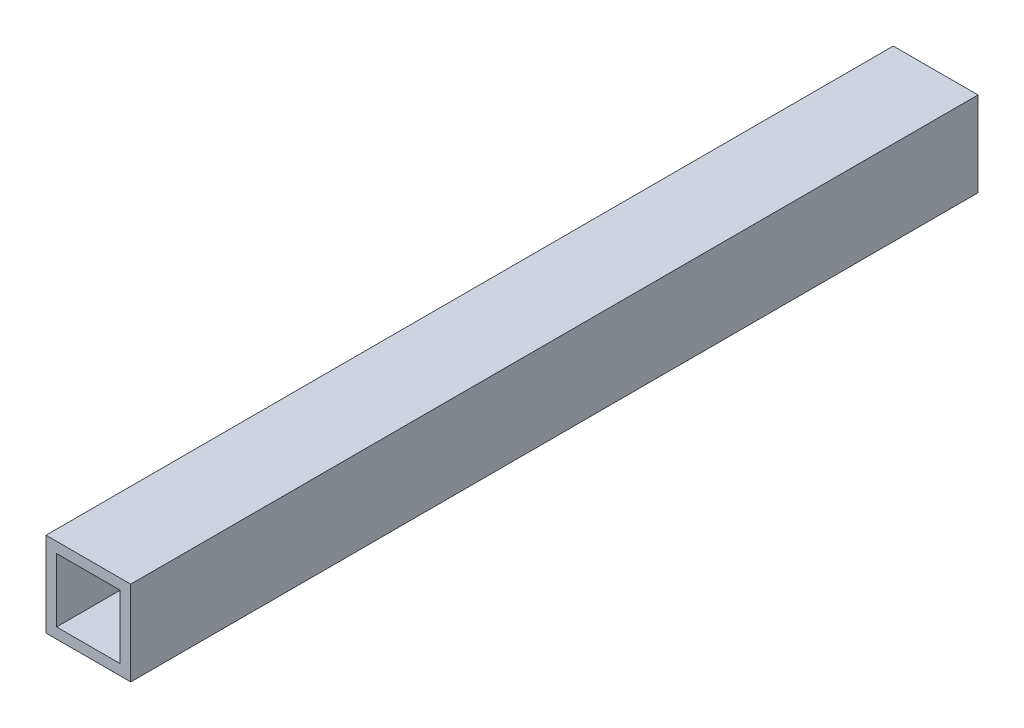
ISO-10303-21;
HEADER;
FILE_DESCRIPTION(('STEP AP214'),'2;1');
FILE_NAME('part.step','',(''),(''),'','','');
FILE_SCHEMA(('AUTOMOTIVE_DESIGN { 1 0 10303 214 1 1 1 1 }'));
ENDSEC;
DATA;
#1=APPLICATION_CONTEXT('core data for automotive mechanical design processes');
#2=APPLICATION_PROTOCOL_DEFINITION('international standard','automotive_design',2000,#1);
#3=PRODUCT_CONTEXT('',#1,'mechanical');
#4=PRODUCT('Part','Part','',(#3));
#5=PRODUCT_RELATED_PRODUCT_CATEGORY('part','',(#4));
#6=PRODUCT_DEFINITION_FORMATION('','',#4);
#7=PRODUCT_DEFINITION_CONTEXT('part definition',#1,'design');
#8=PRODUCT_DEFINITION('design','',#6,#7);
#9=PRODUCT_DEFINITION_SHAPE('','',#8);
#10=(LENGTH_UNIT() NAMED_UNIT(*) SI_UNIT(.MILLI.,.METRE.));
#11=(NAMED_UNIT(*) PLANE_ANGLE_UNIT() SI_UNIT($,.RADIAN.));
#12=(NAMED_UNIT(*) SI_UNIT($,.STERADIAN.) SOLID_ANGLE_UNIT());
#13=UNCERTAINTY_MEASURE_WITH_UNIT(LENGTH_MEASURE(1.E-05),#10,'distance_accuracy_value','');
#14=(GEOMETRIC_REPRESENTATION_CONTEXT(3) GLOBAL_UNCERTAINTY_ASSIGNED_CONTEXT((#13)) GLOBAL_UNIT_ASSIGNED_CONTEXT((#10,
#11,#12)) REPRESENTATION_CONTEXT('',''));
#15=CARTESIAN_POINT('',(0.,0.,0.));
#16=DIRECTION('',(0.,0.,1.));
#17=DIRECTION('',(1.,0.,0.));
#18=AXIS2_PLACEMENT_3D('',#15,#16,#17);
#19=CARTESIAN_POINT('',(0.,0.,200.));
#20=DIRECTION('',(0.,0.,-1.));
#21=DIRECTION('',(-1.,0.,0.));
#22=AXIS2_PLACEMENT_3D('',#19,#20,#21);
#23=PLANE('',#22);
#24=DIRECTION('',(0.,-1.,0.));
#25=VECTOR('',#24,1.);
#26=CARTESIAN_POINT('',(0.,0.,200.));
#27=LINE('',#26,#25);
#28=CARTESIAN_POINT('',(0.,20.,200.));
#29=VERTEX_POINT('',#28);
#30=CARTESIAN_POINT('',(0.,0.,200.));
#31=VERTEX_POINT('',#30);
#32=EDGE_CURVE('E140',#29,#31,#27,.T.);
#33=ORIENTED_EDGE('',*,*,#32,.T.);
#34=DIRECTION('',(1.,0.,0.));
#35=VECTOR('',#34,1.);
#36=CARTESIAN_POINT('',(0.,0.,200.));
#37=LINE('',#36,#35);
#38=CARTESIAN_POINT('',(20.,0.,200.));
#39=VERTEX_POINT('',#38);
#40=EDGE_CURVE('E143',#31,#39,#37,.T.);
#41=ORIENTED_EDGE('',*,*,#40,.T.);
#42=DIRECTION('',(0.,1.,0.));
#43=VECTOR('',#42,1.);
#44=CARTESIAN_POINT('',(20.,0.,200.));
#45=LINE('',#44,#43);
#46=CARTESIAN_POINT('',(20.,20.,200.));
#47=VERTEX_POINT('',#46);
#48=EDGE_CURVE('E146',#39,#47,#45,.T.);
#49=ORIENTED_EDGE('',*,*,#48,.T.);
#50=DIRECTION('',(-1.,0.,0.));
#51=VECTOR('',#50,1.);
#52=CARTESIAN_POINT('',(0.,20.,200.));
#53=LINE('',#52,#51);
#54=EDGE_CURVE('E148',#47,#29,#53,.T.);
#55=ORIENTED_EDGE('',*,*,#54,.T.);
#56=EDGE_LOOP('',(#33,#41,#49,#55));
#57=FACE_BOUND('',#56,.T.);
#58=DIRECTION('',(0.,1.,0.));
#59=VECTOR('',#58,1.);
#60=CARTESIAN_POINT('',(17.5,17.5,200.));
#61=LINE('',#60,#59);
#62=CARTESIAN_POINT('',(17.5,2.5,200.));
#63=VERTEX_POINT('',#62);
#64=CARTESIAN_POINT('',(17.5,17.5,200.));
#65=VERTEX_POINT('',#64);
#66=EDGE_CURVE('E104',#63,#65,#61,.T.);
#67=ORIENTED_EDGE('',*,*,#66,.F.);
#68=DIRECTION('',(1.,0.,0.));
#69=VECTOR('',#68,1.);
#70=CARTESIAN_POINT('',(2.5,2.5,200.));
#71=LINE('',#70,#69);
#72=CARTESIAN_POINT('',(2.5,2.5,200.));
#73=VERTEX_POINT('',#72);
#74=EDGE_CURVE('E126',#73,#63,#71,.T.);
#75=ORIENTED_EDGE('',*,*,#74,.F.);
#76=DIRECTION('',(0.,-1.,0.));
#77=VECTOR('',#76,1.);
#78=CARTESIAN_POINT('',(2.5,17.5,200.));
#79=LINE('',#78,#77);
#80=CARTESIAN_POINT('',(2.5,17.5,200.));
#81=VERTEX_POINT('',#80);
#82=EDGE_CURVE('E124',#81,#73,#79,.T.);
#83=ORIENTED_EDGE('',*,*,#82,.F.);
#84=DIRECTION('',(-1.,0.,0.));
#85=VECTOR('',#84,1.);
#86=CARTESIAN_POINT('',(2.5,17.5,200.));
#87=LINE('',#86,#85);
#88=EDGE_CURVE('E112',#65,#81,#87,.T.);
#89=ORIENTED_EDGE('',*,*,#88,.F.);
#90=EDGE_LOOP('',(#67,#75,#83,#89));
#91=FACE_BOUND('',#90,.T.);
#92=ADVANCED_FACE('F39',(#57,#91),#23,.F.);
#93=CARTESIAN_POINT('',(0.,0.,0.));
#94=DIRECTION('',(0.,0.,-1.));
#95=DIRECTION('',(-1.,0.,0.));
#96=AXIS2_PLACEMENT_3D('',#93,#94,#95);
#97=PLANE('',#96);
#98=DIRECTION('',(0.,-1.,0.));
#99=VECTOR('',#98,1.);
#100=CARTESIAN_POINT('',(0.,0.,0.));
#101=LINE('',#100,#99);
#102=CARTESIAN_POINT('',(0.,20.,0.));
#103=VERTEX_POINT('',#102);
#104=CARTESIAN_POINT('',(0.,0.,0.));
#105=VERTEX_POINT('',#104);
#106=EDGE_CURVE('E120',#103,#105,#101,.T.);
#107=ORIENTED_EDGE('',*,*,#106,.F.);
#108=DIRECTION('',(-1.,0.,0.));
#109=VECTOR('',#108,1.);
#110=CARTESIAN_POINT('',(0.,20.,0.));
#111=LINE('',#110,#109);
#112=CARTESIAN_POINT('',(20.,20.,0.));
#113=VERTEX_POINT('',#112);
#114=EDGE_CURVE('E144',#113,#103,#111,.T.);
#115=ORIENTED_EDGE('',*,*,#114,.F.);
#116=DIRECTION('',(0.,1.,0.));
#117=VECTOR('',#116,1.);
#118=CARTESIAN_POINT('',(20.,0.,0.));
#119=LINE('',#118,#117);
#120=CARTESIAN_POINT('',(20.,0.,0.));
#121=VERTEX_POINT('',#120);
#122=EDGE_CURVE('E155',#121,#113,#119,.T.);
#123=ORIENTED_EDGE('',*,*,#122,.F.);
#124=DIRECTION('',(1.,0.,0.));
#125=VECTOR('',#124,1.);
#126=CARTESIAN_POINT('',(0.,0.,0.));
#127=LINE('',#126,#125);
#128=EDGE_CURVE('E153',#105,#121,#127,.T.);
#129=ORIENTED_EDGE('',*,*,#128,.F.);
#130=EDGE_LOOP('',(#107,#115,#123,#129));
#131=FACE_BOUND('',#130,.T.);
#132=DIRECTION('',(1.,0.,0.));
#133=VECTOR('',#132,1.);
#134=CARTESIAN_POINT('',(2.5,2.5,0.));
#135=LINE('',#134,#133);
#136=CARTESIAN_POINT('',(2.5,2.5,0.));
#137=VERTEX_POINT('',#136);
#138=CARTESIAN_POINT('',(17.5,2.5,0.));
#139=VERTEX_POINT('',#138);
#140=EDGE_CURVE('E113',#137,#139,#135,.T.);
#141=ORIENTED_EDGE('',*,*,#140,.T.);
#142=DIRECTION('',(0.,1.,0.));
#143=VECTOR('',#142,1.);
#144=CARTESIAN_POINT('',(17.5,17.5,0.));
#145=LINE('',#144,#143);
#146=CARTESIAN_POINT('',(17.5,17.5,0.));
#147=VERTEX_POINT('',#146);
#148=EDGE_CURVE('E62',#139,#147,#145,.T.);
#149=ORIENTED_EDGE('',*,*,#148,.T.);
#150=DIRECTION('',(-1.,0.,0.));
#151=VECTOR('',#150,1.);
#152=CARTESIAN_POINT('',(2.5,17.5,0.));
#153=LINE('',#152,#151);
#154=CARTESIAN_POINT('',(2.5,17.5,0.));
#155=VERTEX_POINT('',#154);
#156=EDGE_CURVE('E119',#147,#155,#153,.T.);
#157=ORIENTED_EDGE('',*,*,#156,.T.);
#158=DIRECTION('',(0.,-1.,0.));
#159=VECTOR('',#158,1.);
#160=CARTESIAN_POINT('',(2.5,17.5,0.));
#161=LINE('',#160,#159);
#162=EDGE_CURVE('E132',#155,#137,#161,.T.);
#163=ORIENTED_EDGE('',*,*,#162,.T.);
#164=EDGE_LOOP('',(#141,#149,#157,#163));
#165=FACE_BOUND('',#164,.T.);
#166=ADVANCED_FACE('F173',(#131,#165),#97,.T.);
#167=CARTESIAN_POINT('',(0.,0.,200.));
#168=DIRECTION('',(1.,0.,0.));
#169=DIRECTION('',(0.,0.,-1.));
#170=AXIS2_PLACEMENT_3D('',#167,#168,#169);
#171=PLANE('',#170);
#172=ORIENTED_EDGE('',*,*,#106,.T.);
#173=DIRECTION('',(0.,0.,-1.));
#174=VECTOR('',#173,1.);
#175=CARTESIAN_POINT('',(0.,0.,200.));
#176=LINE('',#175,#174);
#177=EDGE_CURVE('E11',#31,#105,#176,.T.);
#178=ORIENTED_EDGE('',*,*,#177,.F.);
#179=ORIENTED_EDGE('',*,*,#32,.F.);
#180=DIRECTION('',(0.,0.,-1.));
#181=VECTOR('',#180,1.);
#182=CARTESIAN_POINT('',(0.,20.,200.));
#183=LINE('',#182,#181);
#184=EDGE_CURVE('E150',#29,#103,#183,.T.);
#185=ORIENTED_EDGE('',*,*,#184,.T.);
#186=EDGE_LOOP('',(#172,#178,#179,#185));
#187=FACE_BOUND('',#186,.T.);
#188=ADVANCED_FACE('F41',(#187),#171,.F.);
#189=CARTESIAN_POINT('',(0.,0.,200.));
#190=DIRECTION('',(0.,1.,0.));
#191=DIRECTION('',(0.,0.,1.));
#192=AXIS2_PLACEMENT_3D('',#189,#190,#191);
#193=PLANE('',#192);
#194=ORIENTED_EDGE('',*,*,#128,.T.);
#195=DIRECTION('',(0.,0.,-1.));
#196=VECTOR('',#195,1.);
#197=CARTESIAN_POINT('',(20.,0.,200.));
#198=LINE('',#197,#196);
#199=EDGE_CURVE('E47',#39,#121,#198,.T.);
#200=ORIENTED_EDGE('',*,*,#199,.F.);
#201=ORIENTED_EDGE('',*,*,#40,.F.);
#202=ORIENTED_EDGE('',*,*,#177,.T.);
#203=EDGE_LOOP('',(#194,#200,#201,#202));
#204=FACE_BOUND('',#203,.T.);
#205=ADVANCED_FACE('F183',(#204),#193,.F.);
#206=CARTESIAN_POINT('',(20.,0.,200.));
#207=DIRECTION('',(-1.,0.,0.));
#208=DIRECTION('',(0.,0.,1.));
#209=AXIS2_PLACEMENT_3D('',#206,#207,#208);
#210=PLANE('',#209);
#211=ORIENTED_EDGE('',*,*,#122,.T.);
#212=DIRECTION('',(0.,0.,-1.));
#213=VECTOR('',#212,1.);
#214=CARTESIAN_POINT('',(20.,20.,200.));
#215=LINE('',#214,#213);
#216=EDGE_CURVE('E160',#47,#113,#215,.T.);
#217=ORIENTED_EDGE('',*,*,#216,.F.);
#218=ORIENTED_EDGE('',*,*,#48,.F.);
#219=ORIENTED_EDGE('',*,*,#199,.T.);
#220=EDGE_LOOP('',(#211,#217,#218,#219));
#221=FACE_BOUND('',#220,.T.);
#222=ADVANCED_FACE('F167',(#221),#210,.F.);
#223=CARTESIAN_POINT('',(0.,20.,200.));
#224=DIRECTION('',(0.,-1.,0.));
#225=DIRECTION('',(0.,0.,-1.));
#226=AXIS2_PLACEMENT_3D('',#223,#224,#225);
#227=PLANE('',#226);
#228=ORIENTED_EDGE('',*,*,#114,.T.);
#229=ORIENTED_EDGE('',*,*,#184,.F.);
#230=ORIENTED_EDGE('',*,*,#54,.F.);
#231=ORIENTED_EDGE('',*,*,#216,.T.);
#232=EDGE_LOOP('',(#228,#229,#230,#231));
#233=FACE_BOUND('',#232,.T.);
#234=ADVANCED_FACE('F177',(#233),#227,.F.);
#235=CARTESIAN_POINT('',(17.5,17.5,200.));
#236=DIRECTION('',(-1.,0.,0.));
#237=DIRECTION('',(0.,0.,1.));
#238=AXIS2_PLACEMENT_3D('',#235,#236,#237);
#239=PLANE('',#238);
#240=ORIENTED_EDGE('',*,*,#148,.F.);
#241=DIRECTION('',(0.,0.,-1.));
#242=VECTOR('',#241,1.);
#243=CARTESIAN_POINT('',(17.5,2.5,200.));
#244=LINE('',#243,#242);
#245=EDGE_CURVE('E108',#63,#139,#244,.T.);
#246=ORIENTED_EDGE('',*,*,#245,.F.);
#247=ORIENTED_EDGE('',*,*,#66,.T.);
#248=DIRECTION('',(0.,0.,-1.));
#249=VECTOR('',#248,1.);
#250=CARTESIAN_POINT('',(17.5,17.5,200.));
#251=LINE('',#250,#249);
#252=EDGE_CURVE('E107',#65,#147,#251,.T.);
#253=ORIENTED_EDGE('',*,*,#252,.T.);
#254=EDGE_LOOP('',(#240,#246,#247,#253));
#255=FACE_BOUND('',#254,.T.);
#256=ADVANCED_FACE('F106',(#255),#239,.T.);
#257=CARTESIAN_POINT('',(2.5,17.5,200.));
#258=DIRECTION('',(0.,-1.,0.));
#259=DIRECTION('',(0.,0.,-1.));
#260=AXIS2_PLACEMENT_3D('',#257,#258,#259);
#261=PLANE('',#260);
#262=ORIENTED_EDGE('',*,*,#156,.F.);
#263=ORIENTED_EDGE('',*,*,#252,.F.);
#264=ORIENTED_EDGE('',*,*,#88,.T.);
#265=DIRECTION('',(0.,0.,-1.));
#266=VECTOR('',#265,1.);
#267=CARTESIAN_POINT('',(2.5,17.5,200.));
#268=LINE('',#267,#266);
#269=EDGE_CURVE('E121',#81,#155,#268,.T.);
#270=ORIENTED_EDGE('',*,*,#269,.T.);
#271=EDGE_LOOP('',(#262,#263,#264,#270));
#272=FACE_BOUND('',#271,.T.);
#273=ADVANCED_FACE('F116',(#272),#261,.T.);
#274=CARTESIAN_POINT('',(2.5,17.5,200.));
#275=DIRECTION('',(1.,0.,0.));
#276=DIRECTION('',(0.,1.,0.));
#277=AXIS2_PLACEMENT_3D('',#274,#275,#276);
#278=PLANE('',#277);
#279=ORIENTED_EDGE('',*,*,#162,.F.);
#280=ORIENTED_EDGE('',*,*,#269,.F.);
#281=ORIENTED_EDGE('',*,*,#82,.T.);
#282=DIRECTION('',(0.,0.,-1.));
#283=VECTOR('',#282,1.);
#284=CARTESIAN_POINT('',(2.5,2.5,200.));
#285=LINE('',#284,#283);
#286=EDGE_CURVE('E54',#73,#137,#285,.T.);
#287=ORIENTED_EDGE('',*,*,#286,.T.);
#288=EDGE_LOOP('',(#279,#280,#281,#287));
#289=FACE_BOUND('',#288,.T.);
#290=ADVANCED_FACE('F206',(#289),#278,.T.);
#291=CARTESIAN_POINT('',(2.5,2.5,200.));
#292=DIRECTION('',(0.,1.,0.));
#293=DIRECTION('',(0.,0.,1.));
#294=AXIS2_PLACEMENT_3D('',#291,#292,#293);
#295=PLANE('',#294);
#296=ORIENTED_EDGE('',*,*,#140,.F.);
#297=ORIENTED_EDGE('',*,*,#286,.F.);
#298=ORIENTED_EDGE('',*,*,#74,.T.);
#299=ORIENTED_EDGE('',*,*,#245,.T.);
#300=EDGE_LOOP('',(#296,#297,#298,#299));
#301=FACE_BOUND('',#300,.T.);
#302=ADVANCED_FACE('F210',(#301),#295,.T.);
#303=CLOSED_SHELL('',(#92,#166,#188,#205,#222,#234,#256,#273,#290,#302));
#304=MANIFOLD_SOLID_BREP('B2',#303);
#305=ADVANCED_BREP_SHAPE_REPRESENTATION('',(#18,#304),#14);
#306=SHAPE_DEFINITION_REPRESENTATION(#9,#305);
ENDSEC;
END-ISO-10303-21;
